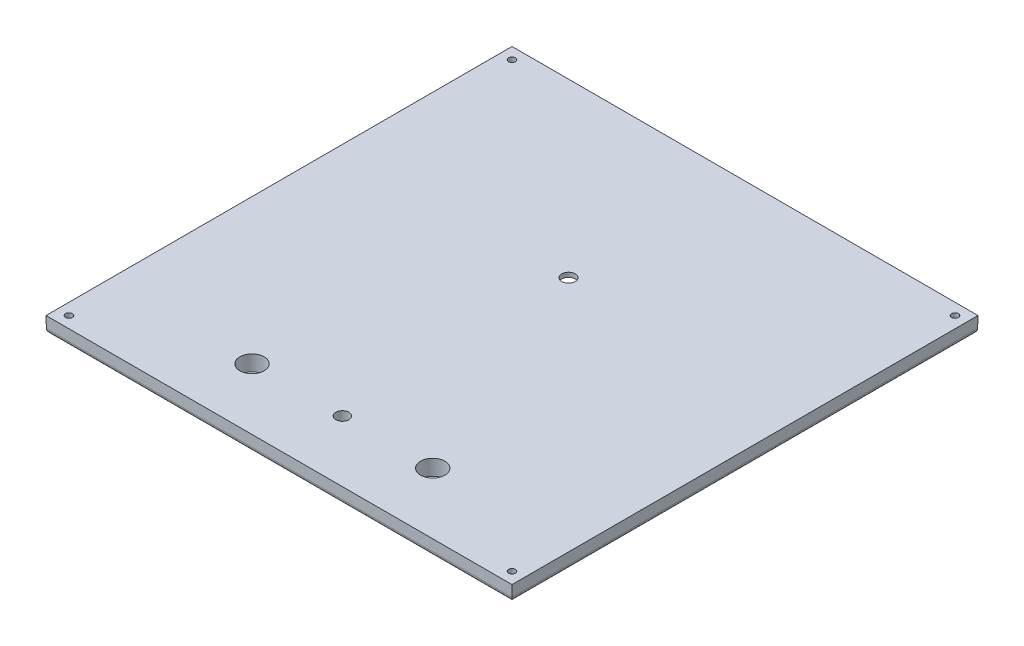
ISO-10303-21;
HEADER;
FILE_DESCRIPTION(('STEP AP214'),'2;1');
FILE_NAME('part.step','',(''),(''),'','','');
FILE_SCHEMA(('AUTOMOTIVE_DESIGN { 1 0 10303 214 1 1 1 1 }'));
ENDSEC;
DATA;
#1=APPLICATION_CONTEXT('core data for automotive mechanical design processes');
#2=APPLICATION_PROTOCOL_DEFINITION('international standard','automotive_design',2000,#1);
#3=PRODUCT_CONTEXT('',#1,'mechanical');
#4=PRODUCT('Part','Part','',(#3));
#5=PRODUCT_RELATED_PRODUCT_CATEGORY('part','',(#4));
#6=PRODUCT_DEFINITION_FORMATION('','',#4);
#7=PRODUCT_DEFINITION_CONTEXT('part definition',#1,'design');
#8=PRODUCT_DEFINITION('design','',#6,#7);
#9=PRODUCT_DEFINITION_SHAPE('','',#8);
#10=(LENGTH_UNIT() NAMED_UNIT(*) SI_UNIT(.MILLI.,.METRE.));
#11=(NAMED_UNIT(*) PLANE_ANGLE_UNIT() SI_UNIT($,.RADIAN.));
#12=(NAMED_UNIT(*) SI_UNIT($,.STERADIAN.) SOLID_ANGLE_UNIT());
#13=UNCERTAINTY_MEASURE_WITH_UNIT(LENGTH_MEASURE(1.E-05),#10,'distance_accuracy_value','');
#14=(GEOMETRIC_REPRESENTATION_CONTEXT(3) GLOBAL_UNCERTAINTY_ASSIGNED_CONTEXT((#13)) GLOBAL_UNIT_ASSIGNED_CONTEXT((#10,
#11,#12)) REPRESENTATION_CONTEXT('',''));
#15=CARTESIAN_POINT('',(0.,0.,0.));
#16=DIRECTION('',(0.,0.,1.));
#17=DIRECTION('',(1.,0.,0.));
#18=AXIS2_PLACEMENT_3D('',#15,#16,#17);
#19=CARTESIAN_POINT('',(-103.,0.,-103.));
#20=DIRECTION('',(0.,-0.0174524064372835,-0.999847695156391));
#21=DIRECTION('',(0.,0.999847695156391,-0.0174524064372835));
#22=AXIS2_PLACEMENT_3D('',#19,#20,#21);
#23=PLANE('',#22);
#24=DIRECTION('',(-0.0174497491606827,-0.999695459881887,0.0174497491606827));
#25=VECTOR('',#24,1.);
#26=CARTESIAN_POINT('',(102.937274288371,-3.59355361247453,-102.937274288371));
#27=LINE('',#26,#25);
#28=CARTESIAN_POINT('',(103.122185454498,7.,-103.122185454498));
#29=VERTEX_POINT('',#28);
#30=CARTESIAN_POINT('',(103.034300864081,1.96509518712543,-103.034300864081));
#31=VERTEX_POINT('',#30);
#32=EDGE_CURVE('E110',#29,#31,#27,.T.);
#33=ORIENTED_EDGE('',*,*,#32,.T.);
#34=DIRECTION('',(1.,0.,0.));
#35=VECTOR('',#34,1.);
#36=CARTESIAN_POINT('',(-103.,1.96509518712543,-103.034300864081));
#37=LINE('',#36,#35);
#38=CARTESIAN_POINT('',(-103.034300864081,1.96509518712543,-103.034300864081));
#39=VERTEX_POINT('',#38);
#40=EDGE_CURVE('E46',#31,#39,#37,.F.);
#41=ORIENTED_EDGE('',*,*,#40,.T.);
#42=DIRECTION('',(-0.0174497491606827,0.999695459881887,-0.0174497491606827));
#43=VECTOR('',#42,1.);
#44=CARTESIAN_POINT('',(-103.,0.,-103.));
#45=LINE('',#44,#43);
#46=CARTESIAN_POINT('',(-103.122185454498,7.,-103.122185454498));
#47=VERTEX_POINT('',#46);
#48=EDGE_CURVE('E94',#47,#39,#45,.F.);
#49=ORIENTED_EDGE('',*,*,#48,.F.);
#50=DIRECTION('',(1.,0.,0.));
#51=VECTOR('',#50,1.);
#52=CARTESIAN_POINT('',(0.,7.,-103.122185454498));
#53=LINE('',#52,#51);
#54=EDGE_CURVE('E97',#47,#29,#53,.T.);
#55=ORIENTED_EDGE('',*,*,#54,.T.);
#56=EDGE_LOOP('',(#33,#41,#49,#55));
#57=FACE_BOUND('',#56,.T.);
#58=ADVANCED_FACE('F37',(#57),#23,.T.);
#59=CARTESIAN_POINT('',(-103.,0.,-103.));
#60=DIRECTION('',(-0.999847695156391,-0.0174524064372835,0.));
#61=DIRECTION('',(0.0174524064372835,-0.999847695156391,0.));
#62=AXIS2_PLACEMENT_3D('',#59,#60,#61);
#63=PLANE('',#62);
#64=ORIENTED_EDGE('',*,*,#48,.T.);
#65=DIRECTION('',(0.,0.,1.));
#66=VECTOR('',#65,1.);
#67=CARTESIAN_POINT('',(-103.034300864081,1.96509518712543,103.));
#68=LINE('',#67,#66);
#69=CARTESIAN_POINT('',(-103.034300864081,1.96509518712543,103.034300864081));
#70=VERTEX_POINT('',#69);
#71=EDGE_CURVE('E102',#39,#70,#68,.T.);
#72=ORIENTED_EDGE('',*,*,#71,.T.);
#73=DIRECTION('',(0.0174497491606827,-0.999695459881887,-0.0174497491606827));
#74=VECTOR('',#73,1.);
#75=CARTESIAN_POINT('',(-103.,0.,103.));
#76=LINE('',#75,#74);
#77=CARTESIAN_POINT('',(-103.122185454498,7.,103.122185454498));
#78=VERTEX_POINT('',#77);
#79=EDGE_CURVE('E103',#78,#70,#76,.T.);
#80=ORIENTED_EDGE('',*,*,#79,.F.);
#81=DIRECTION('',(0.,0.,-1.));
#82=VECTOR('',#81,1.);
#83=CARTESIAN_POINT('',(-103.122185454498,7.,0.));
#84=LINE('',#83,#82);
#85=EDGE_CURVE('E106',#47,#78,#84,.F.);
#86=ORIENTED_EDGE('',*,*,#85,.F.);
#87=EDGE_LOOP('',(#64,#72,#80,#86));
#88=FACE_BOUND('',#87,.T.);
#89=ADVANCED_FACE('F107',(#88),#63,.T.);
#90=CARTESIAN_POINT('',(-103.,0.,103.));
#91=DIRECTION('',(0.,-0.0174524064372835,0.999847695156391));
#92=DIRECTION('',(0.,-0.999847695156391,-0.0174524064372835));
#93=AXIS2_PLACEMENT_3D('',#90,#91,#92);
#94=PLANE('',#93);
#95=ORIENTED_EDGE('',*,*,#79,.T.);
#96=DIRECTION('',(1.,0.,0.));
#97=VECTOR('',#96,1.);
#98=CARTESIAN_POINT('',(103.,1.96509518712543,103.034300864081));
#99=LINE('',#98,#97);
#100=CARTESIAN_POINT('',(103.034300864081,1.96509518712543,103.034300864081));
#101=VERTEX_POINT('',#100);
#102=EDGE_CURVE('E62',#70,#101,#99,.T.);
#103=ORIENTED_EDGE('',*,*,#102,.T.);
#104=DIRECTION('',(0.0174497491606827,0.999695459881887,0.0174497491606827));
#105=VECTOR('',#104,1.);
#106=CARTESIAN_POINT('',(102.937274288371,-3.59355361247453,102.937274288371));
#107=LINE('',#106,#105);
#108=CARTESIAN_POINT('',(103.122185454498,7.,103.122185454498));
#109=VERTEX_POINT('',#108);
#110=EDGE_CURVE('E166',#109,#101,#107,.F.);
#111=ORIENTED_EDGE('',*,*,#110,.F.);
#112=DIRECTION('',(-1.,0.,0.));
#113=VECTOR('',#112,1.);
#114=CARTESIAN_POINT('',(0.,7.,103.122185454498));
#115=LINE('',#114,#113);
#116=EDGE_CURVE('E111',#78,#109,#115,.F.);
#117=ORIENTED_EDGE('',*,*,#116,.F.);
#118=EDGE_LOOP('',(#95,#103,#111,#117));
#119=FACE_BOUND('',#118,.T.);
#120=ADVANCED_FACE('F167',(#119),#94,.T.);
#121=CARTESIAN_POINT('',(103.,0.,-103.));
#122=DIRECTION('',(0.999847695156391,-0.0174524064372835,0.));
#123=DIRECTION('',(0.0174524064372835,0.999847695156391,0.));
#124=AXIS2_PLACEMENT_3D('',#121,#122,#123);
#125=PLANE('',#124);
#126=ORIENTED_EDGE('',*,*,#110,.T.);
#127=DIRECTION('',(0.,0.,1.));
#128=VECTOR('',#127,1.);
#129=CARTESIAN_POINT('',(103.034300864081,1.96509518712543,-103.));
#130=LINE('',#129,#128);
#131=EDGE_CURVE('E54',#101,#31,#130,.F.);
#132=ORIENTED_EDGE('',*,*,#131,.T.);
#133=ORIENTED_EDGE('',*,*,#32,.F.);
#134=DIRECTION('',(0.,0.,1.));
#135=VECTOR('',#134,1.);
#136=CARTESIAN_POINT('',(103.122185454498,7.,0.));
#137=LINE('',#136,#135);
#138=EDGE_CURVE('E116',#29,#109,#137,.T.);
#139=ORIENTED_EDGE('',*,*,#138,.T.);
#140=EDGE_LOOP('',(#126,#132,#133,#139));
#141=FACE_BOUND('',#140,.T.);
#142=ADVANCED_FACE('F168',(#141),#125,.T.);
#143=CARTESIAN_POINT('',(0.,7.,0.));
#144=DIRECTION('',(0.,-1.,0.));
#145=DIRECTION('',(0.,0.,-1.));
#146=AXIS2_PLACEMENT_3D('',#143,#144,#145);
#147=PLANE('',#146);
#148=CARTESIAN_POINT('',(-98.0346054737686,7.,-98.0346054737686));
#149=DIRECTION('',(0.,-1.,0.));
#150=DIRECTION('',(0.,0.,-1.));
#151=AXIS2_PLACEMENT_3D('',#148,#149,#150);
#152=CIRCLE('',#151,1.5);
#153=CARTESIAN_POINT('',(-98.0346054737686,7.,-99.5346054737686));
#154=VERTEX_POINT('',#153);
#155=EDGE_CURVE('E413',#154,#154,#152,.T.);
#156=ORIENTED_EDGE('',*,*,#155,.T.);
#157=EDGE_LOOP('',(#156));
#158=FACE_BOUND('',#157,.T.);
#159=CARTESIAN_POINT('',(98.0346054737686,7.,-98.0346054737686));
#160=DIRECTION('',(0.,-1.,0.));
#161=DIRECTION('',(0.,0.,-1.));
#162=AXIS2_PLACEMENT_3D('',#159,#160,#161);
#163=CIRCLE('',#162,1.5);
#164=CARTESIAN_POINT('',(98.0346054737686,7.,-99.5346054737686));
#165=VERTEX_POINT('',#164);
#166=EDGE_CURVE('E421',#165,#165,#163,.T.);
#167=ORIENTED_EDGE('',*,*,#166,.T.);
#168=EDGE_LOOP('',(#167));
#169=FACE_BOUND('',#168,.T.);
#170=CARTESIAN_POINT('',(98.0346054737686,7.,98.0346054737686));
#171=DIRECTION('',(0.,-1.,0.));
#172=DIRECTION('',(0.,0.,-1.));
#173=AXIS2_PLACEMENT_3D('',#170,#171,#172);
#174=CIRCLE('',#173,1.5);
#175=CARTESIAN_POINT('',(98.0346054737686,7.,96.5346054737686));
#176=VERTEX_POINT('',#175);
#177=EDGE_CURVE('E427',#176,#176,#174,.T.);
#178=ORIENTED_EDGE('',*,*,#177,.T.);
#179=EDGE_LOOP('',(#178));
#180=FACE_BOUND('',#179,.T.);
#181=CARTESIAN_POINT('',(-98.0346054737686,7.,98.0346054737686));
#182=DIRECTION('',(0.,-1.,0.));
#183=DIRECTION('',(0.,0.,-1.));
#184=AXIS2_PLACEMENT_3D('',#181,#182,#183);
#185=CIRCLE('',#184,1.5);
#186=CARTESIAN_POINT('',(-98.0346054737686,7.,96.5346054737686));
#187=VERTEX_POINT('',#186);
#188=EDGE_CURVE('E433',#187,#187,#185,.T.);
#189=ORIENTED_EDGE('',*,*,#188,.T.);
#190=EDGE_LOOP('',(#189));
#191=FACE_BOUND('',#190,.T.);
#192=CARTESIAN_POINT('',(40.9653945262314,7.,76.053252159572));
#193=DIRECTION('',(0.,-1.,0.));
#194=DIRECTION('',(0.,0.,-1.));
#195=AXIS2_PLACEMENT_3D('',#192,#193,#194);
#196=CIRCLE('',#195,5.37781454550247);
#197=CARTESIAN_POINT('',(40.9653945262314,7.,70.6754376140695));
#198=VERTEX_POINT('',#197);
#199=EDGE_CURVE('E443',#198,#198,#196,.T.);
#200=ORIENTED_EDGE('',*,*,#199,.T.);
#201=EDGE_LOOP('',(#200));
#202=FACE_BOUND('',#201,.T.);
#203=CARTESIAN_POINT('',(-39.0346011275322,7.,76.0346054737686));
#204=DIRECTION('',(0.,-1.,0.));
#205=DIRECTION('',(0.,0.,-1.));
#206=AXIS2_PLACEMENT_3D('',#203,#204,#205);
#207=CIRCLE('',#206,5.37781454550247);
#208=CARTESIAN_POINT('',(-39.0346011275322,7.,70.6567909282661));
#209=VERTEX_POINT('',#208);
#210=EDGE_CURVE('E442',#209,#209,#207,.T.);
#211=ORIENTED_EDGE('',*,*,#210,.T.);
#212=EDGE_LOOP('',(#211));
#213=FACE_BOUND('',#212,.T.);
#214=CARTESIAN_POINT('',(0.965394526231386,7.,76.053252159572));
#215=DIRECTION('',(0.,-1.,0.));
#216=DIRECTION('',(0.,0.,-1.));
#217=AXIS2_PLACEMENT_3D('',#214,#215,#216);
#218=CIRCLE('',#217,2.87781454550248);
#219=CARTESIAN_POINT('',(0.965394526231386,7.,73.1754376140695));
#220=VERTEX_POINT('',#219);
#221=EDGE_CURVE('E146',#220,#220,#218,.T.);
#222=ORIENTED_EDGE('',*,*,#221,.T.);
#223=EDGE_LOOP('',(#222));
#224=FACE_BOUND('',#223,.T.);
#225=CARTESIAN_POINT('',(-2.,7.,-27.));
#226=DIRECTION('',(0.,-1.,0.));
#227=DIRECTION('',(0.,0.,-1.));
#228=AXIS2_PLACEMENT_3D('',#225,#226,#227);
#229=CIRCLE('',#228,2.96508987014356);
#230=CARTESIAN_POINT('',(-2.,7.,-29.9650898701436));
#231=VERTEX_POINT('',#230);
#232=EDGE_CURVE('E121',#231,#231,#229,.T.);
#233=ORIENTED_EDGE('',*,*,#232,.T.);
#234=EDGE_LOOP('',(#233));
#235=FACE_BOUND('',#234,.T.);
#236=ORIENTED_EDGE('',*,*,#54,.F.);
#237=ORIENTED_EDGE('',*,*,#85,.T.);
#238=ORIENTED_EDGE('',*,*,#116,.T.);
#239=ORIENTED_EDGE('',*,*,#138,.F.);
#240=EDGE_LOOP('',(#236,#237,#238,#239));
#241=FACE_BOUND('',#240,.T.);
#242=ADVANCED_FACE('F114',(#158,#169,#180,#191,#202,#213,#224,#235,#241),#147,.F.);
#243=CARTESIAN_POINT('',(0.,0.,0.));
#244=DIRECTION('',(0.,-1.,0.));
#245=DIRECTION('',(0.,0.,-1.));
#246=AXIS2_PLACEMENT_3D('',#243,#244,#245);
#247=PLANE('',#246);
#248=CARTESIAN_POINT('',(-98.0346054737686,0.,-98.0346054737686));
#249=DIRECTION('',(0.,-1.,0.));
#250=DIRECTION('',(0.,0.,-1.));
#251=AXIS2_PLACEMENT_3D('',#248,#249,#250);
#252=CIRCLE('',#251,1.5);
#253=CARTESIAN_POINT('',(-98.0346054737686,0.,-99.5346054737686));
#254=VERTEX_POINT('',#253);
#255=EDGE_CURVE('E416',#254,#254,#252,.T.);
#256=ORIENTED_EDGE('',*,*,#255,.F.);
#257=EDGE_LOOP('',(#256));
#258=FACE_BOUND('',#257,.T.);
#259=CARTESIAN_POINT('',(98.0346054737686,0.,-98.0346054737686));
#260=DIRECTION('',(0.,-1.,0.));
#261=DIRECTION('',(0.,0.,-1.));
#262=AXIS2_PLACEMENT_3D('',#259,#260,#261);
#263=CIRCLE('',#262,1.5);
#264=CARTESIAN_POINT('',(98.0346054737686,0.,-99.5346054737686));
#265=VERTEX_POINT('',#264);
#266=EDGE_CURVE('E418',#265,#265,#263,.T.);
#267=ORIENTED_EDGE('',*,*,#266,.F.);
#268=EDGE_LOOP('',(#267));
#269=FACE_BOUND('',#268,.T.);
#270=CARTESIAN_POINT('',(98.0346054737686,0.,98.0346054737686));
#271=DIRECTION('',(0.,-1.,0.));
#272=DIRECTION('',(0.,0.,-1.));
#273=AXIS2_PLACEMENT_3D('',#270,#271,#272);
#274=CIRCLE('',#273,1.5);
#275=CARTESIAN_POINT('',(98.0346054737686,0.,96.5346054737686));
#276=VERTEX_POINT('',#275);
#277=EDGE_CURVE('E424',#276,#276,#274,.T.);
#278=ORIENTED_EDGE('',*,*,#277,.F.);
#279=EDGE_LOOP('',(#278));
#280=FACE_BOUND('',#279,.T.);
#281=CARTESIAN_POINT('',(-98.0346054737686,0.,98.0346054737686));
#282=DIRECTION('',(0.,-1.,0.));
#283=DIRECTION('',(0.,0.,-1.));
#284=AXIS2_PLACEMENT_3D('',#281,#282,#283);
#285=CIRCLE('',#284,1.5);
#286=CARTESIAN_POINT('',(-98.0346054737686,0.,96.5346054737686));
#287=VERTEX_POINT('',#286);
#288=EDGE_CURVE('E430',#287,#287,#285,.T.);
#289=ORIENTED_EDGE('',*,*,#288,.F.);
#290=EDGE_LOOP('',(#289));
#291=FACE_BOUND('',#290,.T.);
#292=CARTESIAN_POINT('',(40.9653945262314,0.,76.053252159572));
#293=DIRECTION('',(0.,-1.,0.));
#294=DIRECTION('',(0.,0.,-1.));
#295=AXIS2_PLACEMENT_3D('',#292,#293,#294);
#296=CIRCLE('',#295,5.5);
#297=CARTESIAN_POINT('',(40.9653945262314,0.,70.553252159572));
#298=VERTEX_POINT('',#297);
#299=EDGE_CURVE('E436',#298,#298,#296,.T.);
#300=ORIENTED_EDGE('',*,*,#299,.F.);
#301=EDGE_LOOP('',(#300));
#302=FACE_BOUND('',#301,.T.);
#303=CARTESIAN_POINT('',(-39.0346011275322,0.,76.0346054737686));
#304=DIRECTION('',(0.,-1.,0.));
#305=DIRECTION('',(0.,0.,-1.));
#306=AXIS2_PLACEMENT_3D('',#303,#304,#305);
#307=CIRCLE('',#306,5.5);
#308=CARTESIAN_POINT('',(-39.0346011275322,0.,70.5346054737686));
#309=VERTEX_POINT('',#308);
#310=EDGE_CURVE('E439',#309,#309,#307,.T.);
#311=ORIENTED_EDGE('',*,*,#310,.F.);
#312=EDGE_LOOP('',(#311));
#313=FACE_BOUND('',#312,.T.);
#314=CARTESIAN_POINT('',(0.965394526231386,0.,76.053252159572));
#315=DIRECTION('',(0.,-1.,0.));
#316=DIRECTION('',(0.,0.,-1.));
#317=AXIS2_PLACEMENT_3D('',#314,#315,#316);
#318=CIRCLE('',#317,3.);
#319=CARTESIAN_POINT('',(0.965394526231386,0.,73.053252159572));
#320=VERTEX_POINT('',#319);
#321=EDGE_CURVE('E446',#320,#320,#318,.T.);
#322=ORIENTED_EDGE('',*,*,#321,.F.);
#323=EDGE_LOOP('',(#322));
#324=FACE_BOUND('',#323,.T.);
#325=DIRECTION('',(-1.,0.,0.));
#326=VECTOR('',#325,1.);
#327=CARTESIAN_POINT('',(-103.,0.,101.034605473769));
#328=LINE('',#327,#326);
#329=CARTESIAN_POINT('',(101.034605473769,0.,101.034605473769));
#330=VERTEX_POINT('',#329);
#331=CARTESIAN_POINT('',(-101.034605473769,0.,101.034605473769));
#332=VERTEX_POINT('',#331);
#333=EDGE_CURVE('E135',#330,#332,#328,.T.);
#334=ORIENTED_EDGE('',*,*,#333,.T.);
#335=DIRECTION('',(0.,0.,-1.));
#336=VECTOR('',#335,1.);
#337=CARTESIAN_POINT('',(-101.034605473769,0.,-103.));
#338=LINE('',#337,#336);
#339=CARTESIAN_POINT('',(-101.034605473769,0.,-101.034605473769));
#340=VERTEX_POINT('',#339);
#341=EDGE_CURVE('E137',#332,#340,#338,.T.);
#342=ORIENTED_EDGE('',*,*,#341,.T.);
#343=DIRECTION('',(1.,0.,0.));
#344=VECTOR('',#343,1.);
#345=CARTESIAN_POINT('',(0.,0.,-101.034605473769));
#346=LINE('',#345,#344);
#347=CARTESIAN_POINT('',(101.034605473769,0.,-101.034605473769));
#348=VERTEX_POINT('',#347);
#349=EDGE_CURVE('E131',#340,#348,#346,.T.);
#350=ORIENTED_EDGE('',*,*,#349,.T.);
#351=DIRECTION('',(0.,0.,1.));
#352=VECTOR('',#351,1.);
#353=CARTESIAN_POINT('',(101.034605473769,0.,0.));
#354=LINE('',#353,#352);
#355=EDGE_CURVE('E133',#348,#330,#354,.T.);
#356=ORIENTED_EDGE('',*,*,#355,.T.);
#357=EDGE_LOOP('',(#334,#342,#350,#356));
#358=FACE_BOUND('',#357,.T.);
#359=CARTESIAN_POINT('',(-2.,0.,-27.));
#360=DIRECTION('',(0.,-1.,0.));
#361=DIRECTION('',(0.,0.,-1.));
#362=AXIS2_PLACEMENT_3D('',#359,#360,#361);
#363=CIRCLE('',#362,71.9653945262314);
#364=CARTESIAN_POINT('',(-2.,0.,-98.9653945262314));
#365=VERTEX_POINT('',#364);
#366=EDGE_CURVE('E128',#365,#365,#363,.F.);
#367=ORIENTED_EDGE('',*,*,#366,.T.);
#368=EDGE_LOOP('',(#367));
#369=FACE_BOUND('',#368,.T.);
#370=ADVANCED_FACE('F195',(#258,#269,#280,#291,#302,#313,#324,#358,#369),#247,.T.);
#371=CARTESIAN_POINT('',(-2.,0.,-27.));
#372=DIRECTION('',(0.,-1.,0.));
#373=DIRECTION('',(0.,0.,-1.));
#374=AXIS2_PLACEMENT_3D('',#371,#372,#373);
#375=CONICAL_SURFACE('',#374,70.,0.0174532925199433);
#376=CARTESIAN_POINT('',(-2.,1.96509518712543,-27.));
#377=DIRECTION('',(0.,-1.,0.));
#378=DIRECTION('',(0.,0.,-1.));
#379=AXIS2_PLACEMENT_3D('',#376,#377,#378);
#380=CIRCLE('',#379,69.9656991359186);
#381=CARTESIAN_POINT('',(-2.,1.96509518712543,-96.9656991359186));
#382=VERTEX_POINT('',#381);
#383=EDGE_CURVE('E11',#382,#382,#380,.T.);
#384=ORIENTED_EDGE('',*,*,#383,.T.);
#385=EDGE_LOOP('',(#384));
#386=FACE_BOUND('',#385,.T.);
#387=CARTESIAN_POINT('',(-2.,5.,-27.));
#388=DIRECTION('',(0.,-1.,0.));
#389=DIRECTION('',(0.,0.,-1.));
#390=AXIS2_PLACEMENT_3D('',#387,#388,#389);
#391=CIRCLE('',#390,69.9127246753589);
#392=CARTESIAN_POINT('',(-2.,5.,-96.9127246753589));
#393=VERTEX_POINT('',#392);
#394=EDGE_CURVE('E117',#393,#393,#391,.T.);
#395=ORIENTED_EDGE('',*,*,#394,.F.);
#396=EDGE_LOOP('',(#395));
#397=FACE_BOUND('',#396,.T.);
#398=ADVANCED_FACE('F222',(#386,#397),#375,.F.);
#399=CARTESIAN_POINT('',(-2.,5.,-27.));
#400=DIRECTION('',(0.,-1.,0.));
#401=DIRECTION('',(0.,0.,-1.));
#402=AXIS2_PLACEMENT_3D('',#399,#400,#401);
#403=PLANE('',#402);
#404=CARTESIAN_POINT('',(-2.,5.,-27.));
#405=DIRECTION('',(0.,-1.,0.));
#406=DIRECTION('',(0.,0.,-1.));
#407=AXIS2_PLACEMENT_3D('',#404,#405,#406);
#408=CIRCLE('',#407,3.);
#409=CARTESIAN_POINT('',(-2.,5.,-30.));
#410=VERTEX_POINT('',#409);
#411=EDGE_CURVE('E153',#410,#410,#408,.T.);
#412=ORIENTED_EDGE('',*,*,#411,.F.);
#413=EDGE_LOOP('',(#412));
#414=FACE_BOUND('',#413,.T.);
#415=ORIENTED_EDGE('',*,*,#394,.T.);
#416=EDGE_LOOP('',(#415));
#417=FACE_BOUND('',#416,.T.);
#418=ADVANCED_FACE('F229',(#414,#417),#403,.T.);
#419=CARTESIAN_POINT('',(-2.,5.,-27.));
#420=DIRECTION('',(0.,-1.,0.));
#421=DIRECTION('',(0.,0.,-1.));
#422=AXIS2_PLACEMENT_3D('',#419,#420,#421);
#423=CONICAL_SURFACE('',#422,3.,0.0174532925199433);
#424=ORIENTED_EDGE('',*,*,#411,.T.);
#425=EDGE_LOOP('',(#424));
#426=FACE_BOUND('',#425,.T.);
#427=ORIENTED_EDGE('',*,*,#232,.F.);
#428=EDGE_LOOP('',(#427));
#429=FACE_BOUND('',#428,.T.);
#430=ADVANCED_FACE('F238',(#426,#429),#423,.F.);
#431=CARTESIAN_POINT('',(101.034605473769,2.,0.));
#432=DIRECTION('',(0.,0.,1.));
#433=DIRECTION('',(1.,0.,0.));
#434=AXIS2_PLACEMENT_3D('',#431,#432,#433);
#435=CYLINDRICAL_SURFACE('',#434,2.);
#436=CARTESIAN_POINT('',(101.034605473769,2.,101.034605473769));
#437=DIRECTION('',(-0.707106781186547,0.,0.707106781186547));
#438=DIRECTION('',(0.707106781186547,0.,0.707106781186547));
#439=AXIS2_PLACEMENT_3D('',#436,#437,#438);
#440=ELLIPSE('',#439,2.82842712474619,2.);
#441=EDGE_CURVE('E147',#330,#101,#440,.T.);
#442=ORIENTED_EDGE('',*,*,#441,.F.);
#443=ORIENTED_EDGE('',*,*,#355,.F.);
#444=CARTESIAN_POINT('',(101.034605473769,2.,-101.034605473769));
#445=DIRECTION('',(0.707106781186547,0.,0.707106781186547));
#446=DIRECTION('',(0.707106781186547,0.,-0.707106781186547));
#447=AXIS2_PLACEMENT_3D('',#444,#445,#446);
#448=ELLIPSE('',#447,2.82842712474619,2.);
#449=EDGE_CURVE('E41',#31,#348,#448,.F.);
#450=ORIENTED_EDGE('',*,*,#449,.F.);
#451=ORIENTED_EDGE('',*,*,#131,.F.);
#452=EDGE_LOOP('',(#442,#443,#450,#451));
#453=FACE_BOUND('',#452,.T.);
#454=ADVANCED_FACE('F171',(#453),#435,.T.);
#455=CARTESIAN_POINT('',(0.,2.,-101.034605473769));
#456=DIRECTION('',(1.,0.,0.));
#457=DIRECTION('',(0.,0.,-1.));
#458=AXIS2_PLACEMENT_3D('',#455,#456,#457);
#459=CYLINDRICAL_SURFACE('',#458,2.);
#460=ORIENTED_EDGE('',*,*,#449,.T.);
#461=ORIENTED_EDGE('',*,*,#349,.F.);
#462=CARTESIAN_POINT('',(-101.034605473769,2.,-101.034605473769));
#463=DIRECTION('',(0.707106781186547,0.,-0.707106781186547));
#464=DIRECTION('',(0.707106781186547,0.,0.707106781186547));
#465=AXIS2_PLACEMENT_3D('',#462,#463,#464);
#466=ELLIPSE('',#465,2.82842712474619,2.);
#467=EDGE_CURVE('E145',#39,#340,#466,.F.);
#468=ORIENTED_EDGE('',*,*,#467,.F.);
#469=ORIENTED_EDGE('',*,*,#40,.F.);
#470=EDGE_LOOP('',(#460,#461,#468,#469));
#471=FACE_BOUND('',#470,.T.);
#472=ADVANCED_FACE('F172',(#471),#459,.T.);
#473=CARTESIAN_POINT('',(-103.,2.,101.034605473769));
#474=DIRECTION('',(1.,0.,0.));
#475=DIRECTION('',(0.,0.,-1.));
#476=AXIS2_PLACEMENT_3D('',#473,#474,#475);
#477=CYLINDRICAL_SURFACE('',#476,2.);
#478=ORIENTED_EDGE('',*,*,#441,.T.);
#479=ORIENTED_EDGE('',*,*,#102,.F.);
#480=CARTESIAN_POINT('',(-101.034605473769,2.,101.034605473769));
#481=DIRECTION('',(0.707106781186547,0.,0.707106781186547));
#482=DIRECTION('',(0.707106781186547,0.,-0.707106781186547));
#483=AXIS2_PLACEMENT_3D('',#480,#481,#482);
#484=ELLIPSE('',#483,2.82842712474619,2.);
#485=EDGE_CURVE('E143',#332,#70,#484,.F.);
#486=ORIENTED_EDGE('',*,*,#485,.F.);
#487=ORIENTED_EDGE('',*,*,#333,.F.);
#488=EDGE_LOOP('',(#478,#479,#486,#487));
#489=FACE_BOUND('',#488,.T.);
#490=ADVANCED_FACE('F178',(#489),#477,.T.);
#491=CARTESIAN_POINT('',(-101.034605473769,2.,-103.));
#492=DIRECTION('',(0.,0.,1.));
#493=DIRECTION('',(1.,0.,0.));
#494=AXIS2_PLACEMENT_3D('',#491,#492,#493);
#495=CYLINDRICAL_SURFACE('',#494,2.);
#496=ORIENTED_EDGE('',*,*,#467,.T.);
#497=ORIENTED_EDGE('',*,*,#341,.F.);
#498=ORIENTED_EDGE('',*,*,#485,.T.);
#499=ORIENTED_EDGE('',*,*,#71,.F.);
#500=EDGE_LOOP('',(#496,#497,#498,#499));
#501=FACE_BOUND('',#500,.T.);
#502=ADVANCED_FACE('F176',(#501),#495,.T.);
#503=CARTESIAN_POINT('',(-2.,2.,-27.));
#504=DIRECTION('',(0.,-1.,0.));
#505=DIRECTION('',(0.,0.,-1.));
#506=AXIS2_PLACEMENT_3D('',#503,#504,#505);
#507=TOROIDAL_SURFACE('',#506,71.9653945262314,2.);
#508=ORIENTED_EDGE('',*,*,#366,.F.);
#509=EDGE_LOOP('',(#508));
#510=FACE_BOUND('',#509,.T.);
#511=ORIENTED_EDGE('',*,*,#383,.F.);
#512=EDGE_LOOP('',(#511));
#513=FACE_BOUND('',#512,.T.);
#514=ADVANCED_FACE('F39',(#510,#513),#507,.T.);
#515=CARTESIAN_POINT('',(0.965394526231386,0.,76.053252159572));
#516=DIRECTION('',(0.,-1.,0.));
#517=DIRECTION('',(0.,0.,-1.));
#518=AXIS2_PLACEMENT_3D('',#515,#516,#517);
#519=CONICAL_SURFACE('',#518,3.,0.0174532925199433);
#520=ORIENTED_EDGE('',*,*,#221,.F.);
#521=EDGE_LOOP('',(#520));
#522=FACE_BOUND('',#521,.T.);
#523=ORIENTED_EDGE('',*,*,#321,.T.);
#524=EDGE_LOOP('',(#523));
#525=FACE_BOUND('',#524,.T.);
#526=ADVANCED_FACE('F276',(#522,#525),#519,.F.);
#527=CARTESIAN_POINT('',(-39.0346011275322,0.,76.0346054737686));
#528=DIRECTION('',(0.,-1.,0.));
#529=DIRECTION('',(0.,0.,-1.));
#530=AXIS2_PLACEMENT_3D('',#527,#528,#529);
#531=CONICAL_SURFACE('',#530,5.5,0.0174532925199433);
#532=ORIENTED_EDGE('',*,*,#210,.F.);
#533=EDGE_LOOP('',(#532));
#534=FACE_BOUND('',#533,.T.);
#535=ORIENTED_EDGE('',*,*,#310,.T.);
#536=EDGE_LOOP('',(#535));
#537=FACE_BOUND('',#536,.T.);
#538=ADVANCED_FACE('F286',(#534,#537),#531,.F.);
#539=CARTESIAN_POINT('',(40.9653945262314,0.,76.053252159572));
#540=DIRECTION('',(0.,-1.,0.));
#541=DIRECTION('',(0.,0.,-1.));
#542=AXIS2_PLACEMENT_3D('',#539,#540,#541);
#543=CONICAL_SURFACE('',#542,5.5,0.0174532925199433);
#544=ORIENTED_EDGE('',*,*,#199,.F.);
#545=EDGE_LOOP('',(#544));
#546=FACE_BOUND('',#545,.T.);
#547=ORIENTED_EDGE('',*,*,#299,.T.);
#548=EDGE_LOOP('',(#547));
#549=FACE_BOUND('',#548,.T.);
#550=ADVANCED_FACE('F297',(#546,#549),#543,.F.);
#551=CARTESIAN_POINT('',(-98.0346054737686,7.,98.0346054737686));
#552=DIRECTION('',(0.,-1.,0.));
#553=DIRECTION('',(0.,0.,-1.));
#554=AXIS2_PLACEMENT_3D('',#551,#552,#553);
#555=CYLINDRICAL_SURFACE('',#554,1.5);
#556=ORIENTED_EDGE('',*,*,#188,.F.);
#557=EDGE_LOOP('',(#556));
#558=FACE_BOUND('',#557,.T.);
#559=ORIENTED_EDGE('',*,*,#288,.T.);
#560=EDGE_LOOP('',(#559));
#561=FACE_BOUND('',#560,.T.);
#562=ADVANCED_FACE('F308',(#558,#561),#555,.F.);
#563=CARTESIAN_POINT('',(98.0346054737686,7.,98.0346054737686));
#564=DIRECTION('',(0.,-1.,0.));
#565=DIRECTION('',(0.,0.,-1.));
#566=AXIS2_PLACEMENT_3D('',#563,#564,#565);
#567=CYLINDRICAL_SURFACE('',#566,1.5);
#568=ORIENTED_EDGE('',*,*,#177,.F.);
#569=EDGE_LOOP('',(#568));
#570=FACE_BOUND('',#569,.T.);
#571=ORIENTED_EDGE('',*,*,#277,.T.);
#572=EDGE_LOOP('',(#571));
#573=FACE_BOUND('',#572,.T.);
#574=ADVANCED_FACE('F319',(#570,#573),#567,.F.);
#575=CARTESIAN_POINT('',(98.0346054737686,7.,-98.0346054737686));
#576=DIRECTION('',(0.,-1.,0.));
#577=DIRECTION('',(0.,0.,-1.));
#578=AXIS2_PLACEMENT_3D('',#575,#576,#577);
#579=CYLINDRICAL_SURFACE('',#578,1.5);
#580=ORIENTED_EDGE('',*,*,#166,.F.);
#581=EDGE_LOOP('',(#580));
#582=FACE_BOUND('',#581,.T.);
#583=ORIENTED_EDGE('',*,*,#266,.T.);
#584=EDGE_LOOP('',(#583));
#585=FACE_BOUND('',#584,.T.);
#586=ADVANCED_FACE('F329',(#582,#585),#579,.F.);
#587=CARTESIAN_POINT('',(-98.0346054737686,7.,-98.0346054737686));
#588=DIRECTION('',(0.,-1.,0.));
#589=DIRECTION('',(0.,0.,-1.));
#590=AXIS2_PLACEMENT_3D('',#587,#588,#589);
#591=CYLINDRICAL_SURFACE('',#590,1.5);
#592=ORIENTED_EDGE('',*,*,#155,.F.);
#593=EDGE_LOOP('',(#592));
#594=FACE_BOUND('',#593,.T.);
#595=ORIENTED_EDGE('',*,*,#255,.T.);
#596=EDGE_LOOP('',(#595));
#597=FACE_BOUND('',#596,.T.);
#598=ADVANCED_FACE('F339',(#594,#597),#591,.F.);
#599=CLOSED_SHELL('',(#58,#89,#120,#142,#242,#370,#398,#418,#430,#454,#472,#490,#502,#514,#526,
#538,#550,#562,#574,#586,#598));
#600=MANIFOLD_SOLID_BREP('B2',#599);
#601=ADVANCED_BREP_SHAPE_REPRESENTATION('',(#18,#600),#14);
#602=SHAPE_DEFINITION_REPRESENTATION(#9,#601);
ENDSEC;
END-ISO-10303-21;
